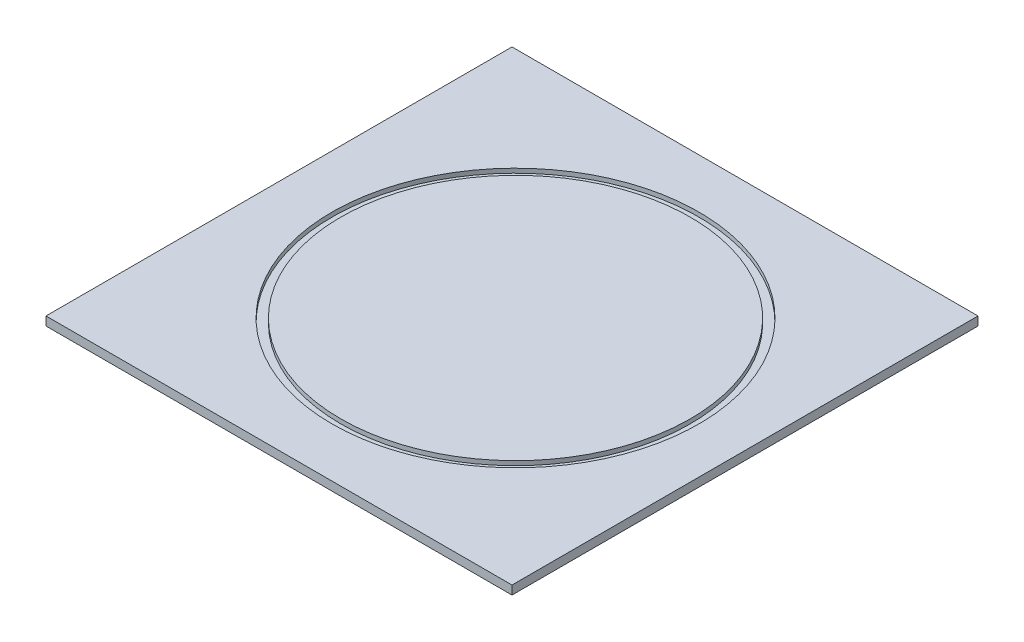
ISO-10303-21;
HEADER;
FILE_DESCRIPTION(('STEP AP214'),'2;1');
FILE_NAME('part.step','',(''),(''),'','','');
FILE_SCHEMA(('AUTOMOTIVE_DESIGN { 1 0 10303 214 1 1 1 1 }'));
ENDSEC;
DATA;
#1=APPLICATION_CONTEXT('core data for automotive mechanical design processes');
#2=APPLICATION_PROTOCOL_DEFINITION('international standard','automotive_design',2000,#1);
#3=PRODUCT_CONTEXT('',#1,'mechanical');
#4=PRODUCT('Part','Part','',(#3));
#5=PRODUCT_RELATED_PRODUCT_CATEGORY('part','',(#4));
#6=PRODUCT_DEFINITION_FORMATION('','',#4);
#7=PRODUCT_DEFINITION_CONTEXT('part definition',#1,'design');
#8=PRODUCT_DEFINITION('design','',#6,#7);
#9=PRODUCT_DEFINITION_SHAPE('','',#8);
#10=(LENGTH_UNIT() NAMED_UNIT(*) SI_UNIT(.MILLI.,.METRE.));
#11=(NAMED_UNIT(*) PLANE_ANGLE_UNIT() SI_UNIT($,.RADIAN.));
#12=(NAMED_UNIT(*) SI_UNIT($,.STERADIAN.) SOLID_ANGLE_UNIT());
#13=UNCERTAINTY_MEASURE_WITH_UNIT(LENGTH_MEASURE(1.E-05),#10,'distance_accuracy_value','');
#14=(GEOMETRIC_REPRESENTATION_CONTEXT(3) GLOBAL_UNCERTAINTY_ASSIGNED_CONTEXT((#13)) GLOBAL_UNIT_ASSIGNED_CONTEXT((#10,
#11,#12)) REPRESENTATION_CONTEXT('',''));
#15=CARTESIAN_POINT('',(0.,0.,0.));
#16=DIRECTION('',(0.,0.,1.));
#17=DIRECTION('',(1.,0.,0.));
#18=AXIS2_PLACEMENT_3D('',#15,#16,#17);
#19=CARTESIAN_POINT('',(-40.6040957725668,1.5,-40.));
#20=DIRECTION('',(1.,0.,0.));
#21=DIRECTION('',(0.,0.,-1.));
#22=AXIS2_PLACEMENT_3D('',#19,#20,#21);
#23=PLANE('',#22);
#24=DIRECTION('',(0.,0.,1.));
#25=VECTOR('',#24,1.);
#26=CARTESIAN_POINT('',(-40.6040957725668,0.,-40.));
#27=LINE('',#26,#25);
#28=CARTESIAN_POINT('',(-40.6040957725668,0.,-40.));
#29=VERTEX_POINT('',#28);
#30=CARTESIAN_POINT('',(-40.6040957725668,0.,40.));
#31=VERTEX_POINT('',#30);
#32=EDGE_CURVE('E96',#29,#31,#27,.T.);
#33=ORIENTED_EDGE('',*,*,#32,.T.);
#34=DIRECTION('',(0.,-1.,0.));
#35=VECTOR('',#34,1.);
#36=CARTESIAN_POINT('',(-40.6040957725668,1.5,40.));
#37=LINE('',#36,#35);
#38=CARTESIAN_POINT('',(-40.6040957725668,1.5,40.));
#39=VERTEX_POINT('',#38);
#40=EDGE_CURVE('E11',#39,#31,#37,.T.);
#41=ORIENTED_EDGE('',*,*,#40,.F.);
#42=DIRECTION('',(0.,0.,1.));
#43=VECTOR('',#42,1.);
#44=CARTESIAN_POINT('',(-40.6040957725668,1.5,-40.));
#45=LINE('',#44,#43);
#46=CARTESIAN_POINT('',(-40.6040957725668,1.5,-40.));
#47=VERTEX_POINT('',#46);
#48=EDGE_CURVE('E84',#47,#39,#45,.T.);
#49=ORIENTED_EDGE('',*,*,#48,.F.);
#50=DIRECTION('',(0.,-1.,0.));
#51=VECTOR('',#50,1.);
#52=CARTESIAN_POINT('',(-40.6040957725668,1.5,-40.));
#53=LINE('',#52,#51);
#54=EDGE_CURVE('E92',#47,#29,#53,.T.);
#55=ORIENTED_EDGE('',*,*,#54,.T.);
#56=EDGE_LOOP('',(#33,#41,#49,#55));
#57=FACE_BOUND('',#56,.T.);
#58=ADVANCED_FACE('F33',(#57),#23,.F.);
#59=CARTESIAN_POINT('',(39.3959042274332,1.5,40.));
#60=DIRECTION('',(0.,0.,-1.));
#61=DIRECTION('',(-1.,0.,0.));
#62=AXIS2_PLACEMENT_3D('',#59,#60,#61);
#63=PLANE('',#62);
#64=DIRECTION('',(1.,0.,0.));
#65=VECTOR('',#64,1.);
#66=CARTESIAN_POINT('',(39.3959042274332,0.,40.));
#67=LINE('',#66,#65);
#68=CARTESIAN_POINT('',(39.3959042274332,0.,40.));
#69=VERTEX_POINT('',#68);
#70=EDGE_CURVE('E88',#31,#69,#67,.T.);
#71=ORIENTED_EDGE('',*,*,#70,.T.);
#72=DIRECTION('',(0.,-1.,0.));
#73=VECTOR('',#72,1.);
#74=CARTESIAN_POINT('',(39.3959042274332,1.5,40.));
#75=LINE('',#74,#73);
#76=CARTESIAN_POINT('',(39.3959042274332,1.5,40.));
#77=VERTEX_POINT('',#76);
#78=EDGE_CURVE('E41',#77,#69,#75,.T.);
#79=ORIENTED_EDGE('',*,*,#78,.F.);
#80=DIRECTION('',(1.,0.,0.));
#81=VECTOR('',#80,1.);
#82=CARTESIAN_POINT('',(39.3959042274332,1.5,40.));
#83=LINE('',#82,#81);
#84=EDGE_CURVE('E79',#39,#77,#83,.T.);
#85=ORIENTED_EDGE('',*,*,#84,.F.);
#86=ORIENTED_EDGE('',*,*,#40,.T.);
#87=EDGE_LOOP('',(#71,#79,#85,#86));
#88=FACE_BOUND('',#87,.T.);
#89=ADVANCED_FACE('F87',(#88),#63,.F.);
#90=CARTESIAN_POINT('',(39.3959042274332,1.5,-40.));
#91=DIRECTION('',(-1.,0.,0.));
#92=DIRECTION('',(0.,0.,1.));
#93=AXIS2_PLACEMENT_3D('',#90,#91,#92);
#94=PLANE('',#93);
#95=DIRECTION('',(0.,0.,-1.));
#96=VECTOR('',#95,1.);
#97=CARTESIAN_POINT('',(39.3959042274332,0.,-40.));
#98=LINE('',#97,#96);
#99=CARTESIAN_POINT('',(39.3959042274332,0.,-40.));
#100=VERTEX_POINT('',#99);
#101=EDGE_CURVE('E66',#69,#100,#98,.T.);
#102=ORIENTED_EDGE('',*,*,#101,.T.);
#103=DIRECTION('',(0.,-1.,0.));
#104=VECTOR('',#103,1.);
#105=CARTESIAN_POINT('',(39.3959042274332,1.5,-40.));
#106=LINE('',#105,#104);
#107=CARTESIAN_POINT('',(39.3959042274332,1.5,-40.));
#108=VERTEX_POINT('',#107);
#109=EDGE_CURVE('E89',#108,#100,#106,.T.);
#110=ORIENTED_EDGE('',*,*,#109,.F.);
#111=DIRECTION('',(0.,0.,-1.));
#112=VECTOR('',#111,1.);
#113=CARTESIAN_POINT('',(39.3959042274332,1.5,-40.));
#114=LINE('',#113,#112);
#115=EDGE_CURVE('E82',#77,#108,#114,.T.);
#116=ORIENTED_EDGE('',*,*,#115,.F.);
#117=ORIENTED_EDGE('',*,*,#78,.T.);
#118=EDGE_LOOP('',(#102,#110,#116,#117));
#119=FACE_BOUND('',#118,.T.);
#120=ADVANCED_FACE('F90',(#119),#94,.F.);
#121=CARTESIAN_POINT('',(39.3959042274332,1.5,-40.));
#122=DIRECTION('',(0.,0.,1.));
#123=DIRECTION('',(1.,0.,0.));
#124=AXIS2_PLACEMENT_3D('',#121,#122,#123);
#125=PLANE('',#124);
#126=DIRECTION('',(-1.,0.,0.));
#127=VECTOR('',#126,1.);
#128=CARTESIAN_POINT('',(39.3959042274332,0.,-40.));
#129=LINE('',#128,#127);
#130=EDGE_CURVE('E72',#100,#29,#129,.T.);
#131=ORIENTED_EDGE('',*,*,#130,.T.);
#132=ORIENTED_EDGE('',*,*,#54,.F.);
#133=DIRECTION('',(-1.,0.,0.));
#134=VECTOR('',#133,1.);
#135=CARTESIAN_POINT('',(39.3959042274332,1.5,-40.));
#136=LINE('',#135,#134);
#137=EDGE_CURVE('E49',#108,#47,#136,.T.);
#138=ORIENTED_EDGE('',*,*,#137,.F.);
#139=ORIENTED_EDGE('',*,*,#109,.T.);
#140=EDGE_LOOP('',(#131,#132,#138,#139));
#141=FACE_BOUND('',#140,.T.);
#142=ADVANCED_FACE('F104',(#141),#125,.F.);
#143=CARTESIAN_POINT('',(0.,1.5,0.));
#144=DIRECTION('',(0.,-1.,0.));
#145=DIRECTION('',(0.,0.,-1.));
#146=AXIS2_PLACEMENT_3D('',#143,#144,#145);
#147=PLANE('',#146);
#148=CARTESIAN_POINT('',(0.,1.5,0.));
#149=DIRECTION('',(0.,1.,0.));
#150=DIRECTION('',(0.,0.,1.));
#151=AXIS2_PLACEMENT_3D('',#148,#149,#150);
#152=CIRCLE('',#151,31.5);
#153=CARTESIAN_POINT('',(0.,1.5,31.5));
#154=VERTEX_POINT('',#153);
#155=EDGE_CURVE('E110',#154,#154,#152,.T.);
#156=ORIENTED_EDGE('',*,*,#155,.F.);
#157=EDGE_LOOP('',(#156));
#158=FACE_BOUND('',#157,.T.);
#159=ORIENTED_EDGE('',*,*,#48,.T.);
#160=ORIENTED_EDGE('',*,*,#84,.T.);
#161=ORIENTED_EDGE('',*,*,#115,.T.);
#162=ORIENTED_EDGE('',*,*,#137,.T.);
#163=EDGE_LOOP('',(#159,#160,#161,#162));
#164=FACE_BOUND('',#163,.T.);
#165=ADVANCED_FACE('F80',(#158,#164),#147,.F.);
#166=CARTESIAN_POINT('',(0.,0.,0.));
#167=DIRECTION('',(0.,-1.,0.));
#168=DIRECTION('',(0.,0.,-1.));
#169=AXIS2_PLACEMENT_3D('',#166,#167,#168);
#170=PLANE('',#169);
#171=ORIENTED_EDGE('',*,*,#32,.F.);
#172=ORIENTED_EDGE('',*,*,#130,.F.);
#173=ORIENTED_EDGE('',*,*,#101,.F.);
#174=ORIENTED_EDGE('',*,*,#70,.F.);
#175=EDGE_LOOP('',(#171,#172,#173,#174));
#176=FACE_BOUND('',#175,.T.);
#177=ADVANCED_FACE('F107',(#176),#170,.T.);
#178=CARTESIAN_POINT('',(0.,0.75,0.));
#179=DIRECTION('',(0.,1.,0.));
#180=DIRECTION('',(0.,0.,1.));
#181=AXIS2_PLACEMENT_3D('',#178,#179,#180);
#182=CYLINDRICAL_SURFACE('',#181,31.5);
#183=CARTESIAN_POINT('',(0.,0.75,0.));
#184=DIRECTION('',(0.,1.,0.));
#185=DIRECTION('',(0.,0.,1.));
#186=AXIS2_PLACEMENT_3D('',#183,#184,#185);
#187=CIRCLE('',#186,31.5);
#188=CARTESIAN_POINT('',(0.,0.75,31.5));
#189=VERTEX_POINT('',#188);
#190=EDGE_CURVE('E99',#189,#189,#187,.T.);
#191=ORIENTED_EDGE('',*,*,#190,.F.);
#192=EDGE_LOOP('',(#191));
#193=FACE_BOUND('',#192,.T.);
#194=ORIENTED_EDGE('',*,*,#155,.T.);
#195=EDGE_LOOP('',(#194));
#196=FACE_BOUND('',#195,.T.);
#197=ADVANCED_FACE('F128',(#193,#196),#182,.F.);
#198=CARTESIAN_POINT('',(0.,0.75,0.));
#199=DIRECTION('',(0.,1.,0.));
#200=DIRECTION('',(0.,0.,1.));
#201=AXIS2_PLACEMENT_3D('',#198,#199,#200);
#202=PLANE('',#201);
#203=CARTESIAN_POINT('',(0.,0.75,0.));
#204=DIRECTION('',(0.,1.,0.));
#205=DIRECTION('',(0.,0.,1.));
#206=AXIS2_PLACEMENT_3D('',#203,#204,#205);
#207=CIRCLE('',#206,30.);
#208=CARTESIAN_POINT('',(0.,0.75,30.));
#209=VERTEX_POINT('',#208);
#210=EDGE_CURVE('E113',#209,#209,#207,.T.);
#211=ORIENTED_EDGE('',*,*,#210,.F.);
#212=EDGE_LOOP('',(#211));
#213=FACE_BOUND('',#212,.T.);
#214=ORIENTED_EDGE('',*,*,#190,.T.);
#215=EDGE_LOOP('',(#214));
#216=FACE_BOUND('',#215,.T.);
#217=ADVANCED_FACE('F125',(#213,#216),#202,.T.);
#218=CARTESIAN_POINT('',(0.,0.75,0.));
#219=DIRECTION('',(0.,1.,0.));
#220=DIRECTION('',(0.,0.,1.));
#221=AXIS2_PLACEMENT_3D('',#218,#219,#220);
#222=CYLINDRICAL_SURFACE('',#221,30.);
#223=ORIENTED_EDGE('',*,*,#210,.T.);
#224=EDGE_LOOP('',(#223));
#225=FACE_BOUND('',#224,.T.);
#226=CARTESIAN_POINT('',(0.,1.5,0.));
#227=DIRECTION('',(0.,1.,0.));
#228=DIRECTION('',(0.,0.,1.));
#229=AXIS2_PLACEMENT_3D('',#226,#227,#228);
#230=CIRCLE('',#229,30.);
#231=CARTESIAN_POINT('',(0.,1.5,30.));
#232=VERTEX_POINT('',#231);
#233=EDGE_CURVE('E116',#232,#232,#230,.T.);
#234=ORIENTED_EDGE('',*,*,#233,.F.);
#235=EDGE_LOOP('',(#234));
#236=FACE_BOUND('',#235,.T.);
#237=ADVANCED_FACE('F122',(#225,#236),#222,.T.);
#238=ORIENTED_EDGE('',*,*,#233,.T.);
#239=EDGE_LOOP('',(#238));
#240=FACE_BOUND('',#239,.T.);
#241=ADVANCED_FACE('F139',(#240),#147,.F.);
#242=CLOSED_SHELL('',(#58,#89,#120,#142,#165,#177,#197,#217,#237,#241));
#243=MANIFOLD_SOLID_BREP('B2',#242);
#244=ADVANCED_BREP_SHAPE_REPRESENTATION('',(#18,#243),#14);
#245=SHAPE_DEFINITION_REPRESENTATION(#9,#244);
ENDSEC;
END-ISO-10303-21;
